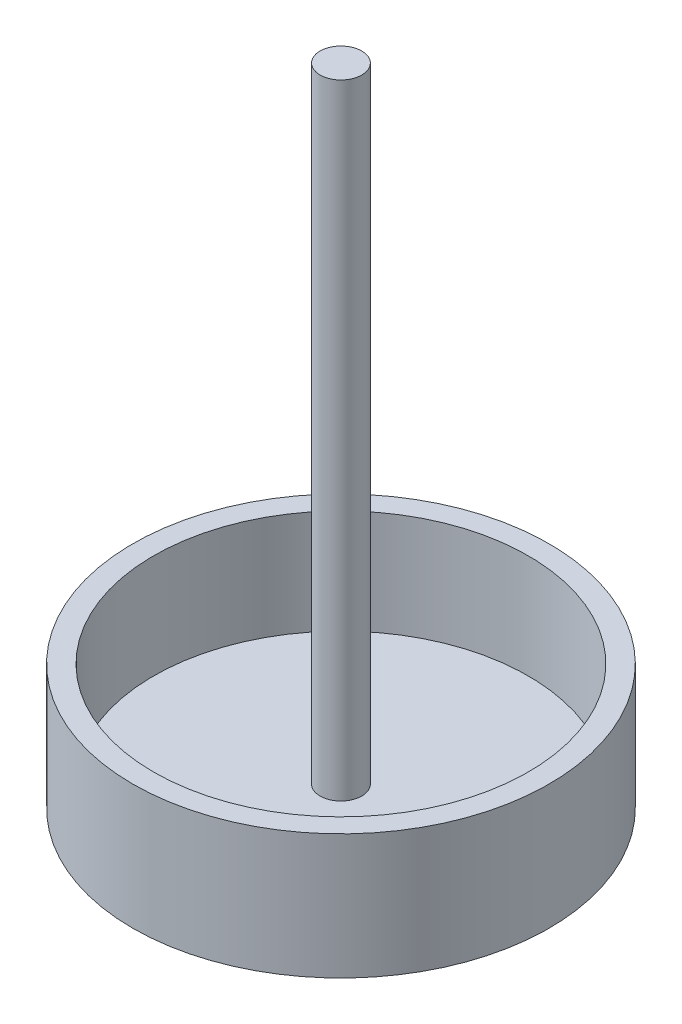
ISO-10303-21;
HEADER;
FILE_DESCRIPTION(('STEP AP214'),'2;1');
FILE_NAME('part.step','',(''),(''),'','','');
FILE_SCHEMA(('AUTOMOTIVE_DESIGN { 1 0 10303 214 1 1 1 1 }'));
ENDSEC;
DATA;
#1=APPLICATION_CONTEXT('core data for automotive mechanical design processes');
#2=APPLICATION_PROTOCOL_DEFINITION('international standard','automotive_design',2000,#1);
#3=PRODUCT_CONTEXT('',#1,'mechanical');
#4=PRODUCT('Part','Part','',(#3));
#5=PRODUCT_RELATED_PRODUCT_CATEGORY('part','',(#4));
#6=PRODUCT_DEFINITION_FORMATION('','',#4);
#7=PRODUCT_DEFINITION_CONTEXT('part definition',#1,'design');
#8=PRODUCT_DEFINITION('design','',#6,#7);
#9=PRODUCT_DEFINITION_SHAPE('','',#8);
#10=(LENGTH_UNIT() NAMED_UNIT(*) SI_UNIT(.MILLI.,.METRE.));
#11=(NAMED_UNIT(*) PLANE_ANGLE_UNIT() SI_UNIT($,.RADIAN.));
#12=(NAMED_UNIT(*) SI_UNIT($,.STERADIAN.) SOLID_ANGLE_UNIT());
#13=UNCERTAINTY_MEASURE_WITH_UNIT(LENGTH_MEASURE(1.E-05),#10,'distance_accuracy_value','');
#14=(GEOMETRIC_REPRESENTATION_CONTEXT(3) GLOBAL_UNCERTAINTY_ASSIGNED_CONTEXT((#13)) GLOBAL_UNIT_ASSIGNED_CONTEXT((#10,
#11,#12)) REPRESENTATION_CONTEXT('',''));
#15=CARTESIAN_POINT('',(0.,0.,0.));
#16=DIRECTION('',(0.,0.,1.));
#17=DIRECTION('',(1.,0.,0.));
#18=AXIS2_PLACEMENT_3D('',#15,#16,#17);
#19=CARTESIAN_POINT('',(0.,3.,0.));
#20=DIRECTION('',(0.,-1.,0.));
#21=DIRECTION('',(0.,0.,-1.));
#22=AXIS2_PLACEMENT_3D('',#19,#20,#21);
#23=CYLINDRICAL_SURFACE('',#22,5.);
#24=CARTESIAN_POINT('',(0.,3.,0.));
#25=DIRECTION('',(0.,1.,0.));
#26=DIRECTION('',(0.,0.,1.));
#27=AXIS2_PLACEMENT_3D('',#24,#25,#26);
#28=CIRCLE('',#27,5.);
#29=CARTESIAN_POINT('',(0.,3.,5.));
#30=VERTEX_POINT('',#29);
#31=EDGE_CURVE('E10',#30,#30,#28,.T.);
#32=ORIENTED_EDGE('',*,*,#31,.F.);
#33=EDGE_LOOP('',(#32));
#34=FACE_BOUND('',#33,.T.);
#35=CARTESIAN_POINT('',(0.,0.,0.));
#36=DIRECTION('',(0.,1.,0.));
#37=DIRECTION('',(0.,0.,1.));
#38=AXIS2_PLACEMENT_3D('',#35,#36,#37);
#39=CIRCLE('',#38,5.);
#40=CARTESIAN_POINT('',(0.,0.,5.));
#41=VERTEX_POINT('',#40);
#42=EDGE_CURVE('E33',#41,#41,#39,.T.);
#43=ORIENTED_EDGE('',*,*,#42,.T.);
#44=EDGE_LOOP('',(#43));
#45=FACE_BOUND('',#44,.T.);
#46=ADVANCED_FACE('F30',(#34,#45),#23,.T.);
#47=CARTESIAN_POINT('',(0.,3.,0.));
#48=DIRECTION('',(0.,1.,0.));
#49=DIRECTION('',(0.,0.,1.));
#50=AXIS2_PLACEMENT_3D('',#47,#48,#49);
#51=PLANE('',#50);
#52=CARTESIAN_POINT('',(0.,3.,0.));
#53=DIRECTION('',(0.,1.,0.));
#54=DIRECTION('',(0.,0.,1.));
#55=AXIS2_PLACEMENT_3D('',#52,#53,#54);
#56=CIRCLE('',#55,4.5);
#57=CARTESIAN_POINT('',(0.,3.,4.5));
#58=VERTEX_POINT('',#57);
#59=EDGE_CURVE('E42',#58,#58,#56,.T.);
#60=ORIENTED_EDGE('',*,*,#59,.F.);
#61=EDGE_LOOP('',(#60));
#62=FACE_BOUND('',#61,.T.);
#63=ORIENTED_EDGE('',*,*,#31,.T.);
#64=EDGE_LOOP('',(#63));
#65=FACE_BOUND('',#64,.T.);
#66=ADVANCED_FACE('F75',(#62,#65),#51,.T.);
#67=CARTESIAN_POINT('',(0.,0.,0.));
#68=DIRECTION('',(0.,1.,0.));
#69=DIRECTION('',(0.,0.,1.));
#70=AXIS2_PLACEMENT_3D('',#67,#68,#69);
#71=PLANE('',#70);
#72=ORIENTED_EDGE('',*,*,#42,.F.);
#73=EDGE_LOOP('',(#72));
#74=FACE_BOUND('',#73,.T.);
#75=ADVANCED_FACE('F71',(#74),#71,.F.);
#76=CARTESIAN_POINT('',(0.,0.5,0.));
#77=DIRECTION('',(0.,1.,0.));
#78=DIRECTION('',(0.,0.,1.));
#79=AXIS2_PLACEMENT_3D('',#76,#77,#78);
#80=CYLINDRICAL_SURFACE('',#79,4.5);
#81=CARTESIAN_POINT('',(0.,0.5,0.));
#82=DIRECTION('',(0.,1.,0.));
#83=DIRECTION('',(0.,0.,1.));
#84=AXIS2_PLACEMENT_3D('',#81,#82,#83);
#85=CIRCLE('',#84,4.5);
#86=CARTESIAN_POINT('',(0.,0.5,4.5));
#87=VERTEX_POINT('',#86);
#88=EDGE_CURVE('E40',#87,#87,#85,.T.);
#89=ORIENTED_EDGE('',*,*,#88,.F.);
#90=EDGE_LOOP('',(#89));
#91=FACE_BOUND('',#90,.T.);
#92=ORIENTED_EDGE('',*,*,#59,.T.);
#93=EDGE_LOOP('',(#92));
#94=FACE_BOUND('',#93,.T.);
#95=ADVANCED_FACE('F65',(#91,#94),#80,.F.);
#96=CARTESIAN_POINT('',(0.,0.5,0.));
#97=DIRECTION('',(0.,1.,0.));
#98=DIRECTION('',(0.,0.,1.));
#99=AXIS2_PLACEMENT_3D('',#96,#97,#98);
#100=PLANE('',#99);
#101=CARTESIAN_POINT('',(0.,0.5,0.));
#102=DIRECTION('',(0.,1.,0.));
#103=DIRECTION('',(0.,0.,1.));
#104=AXIS2_PLACEMENT_3D('',#101,#102,#103);
#105=CIRCLE('',#104,0.5);
#106=CARTESIAN_POINT('',(0.,0.5,0.5));
#107=VERTEX_POINT('',#106);
#108=EDGE_CURVE('E48',#107,#107,#105,.T.);
#109=ORIENTED_EDGE('',*,*,#108,.F.);
#110=EDGE_LOOP('',(#109));
#111=FACE_BOUND('',#110,.T.);
#112=ORIENTED_EDGE('',*,*,#88,.T.);
#113=EDGE_LOOP('',(#112));
#114=FACE_BOUND('',#113,.T.);
#115=ADVANCED_FACE('F59',(#111,#114),#100,.T.);
#116=CARTESIAN_POINT('',(0.,15.5,0.));
#117=DIRECTION('',(0.,-1.,0.));
#118=DIRECTION('',(0.,0.,-1.));
#119=AXIS2_PLACEMENT_3D('',#116,#117,#118);
#120=CYLINDRICAL_SURFACE('',#119,0.5);
#121=CARTESIAN_POINT('',(0.,15.5,0.));
#122=DIRECTION('',(0.,1.,0.));
#123=DIRECTION('',(0.,0.,1.));
#124=AXIS2_PLACEMENT_3D('',#121,#122,#123);
#125=CIRCLE('',#124,0.5);
#126=CARTESIAN_POINT('',(0.,15.5,0.5));
#127=VERTEX_POINT('',#126);
#128=EDGE_CURVE('E45',#127,#127,#125,.T.);
#129=ORIENTED_EDGE('',*,*,#128,.F.);
#130=EDGE_LOOP('',(#129));
#131=FACE_BOUND('',#130,.T.);
#132=ORIENTED_EDGE('',*,*,#108,.T.);
#133=EDGE_LOOP('',(#132));
#134=FACE_BOUND('',#133,.T.);
#135=ADVANCED_FACE('F56',(#131,#134),#120,.T.);
#136=CARTESIAN_POINT('',(0.,15.5,0.));
#137=DIRECTION('',(0.,1.,0.));
#138=DIRECTION('',(0.,0.,1.));
#139=AXIS2_PLACEMENT_3D('',#136,#137,#138);
#140=PLANE('',#139);
#141=ORIENTED_EDGE('',*,*,#128,.T.);
#142=EDGE_LOOP('',(#141));
#143=FACE_BOUND('',#142,.T.);
#144=ADVANCED_FACE('F54',(#143),#140,.T.);
#145=CLOSED_SHELL('',(#46,#66,#75,#95,#115,#135,#144));
#146=MANIFOLD_SOLID_BREP('B2',#145);
#147=ADVANCED_BREP_SHAPE_REPRESENTATION('',(#18,#146),#14);
#148=SHAPE_DEFINITION_REPRESENTATION(#9,#147);
ENDSEC;
END-ISO-10303-21;
